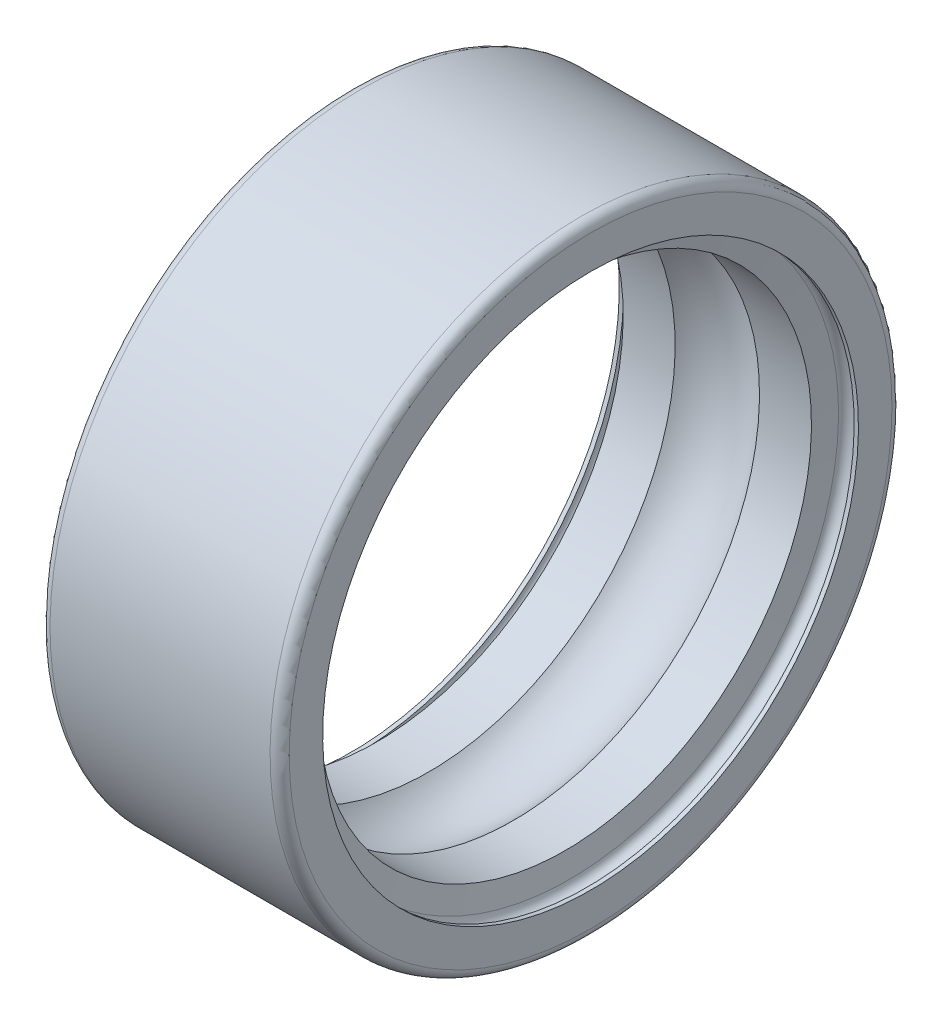
ISO-10303-21;
HEADER;
FILE_DESCRIPTION(('STEP AP214'),'2;1');
FILE_NAME('part.step','',(''),(''),'','','');
FILE_SCHEMA(('AUTOMOTIVE_DESIGN { 1 0 10303 214 1 1 1 1 }'));
ENDSEC;
DATA;
#1=APPLICATION_CONTEXT('core data for automotive mechanical design processes');
#2=APPLICATION_PROTOCOL_DEFINITION('international standard','automotive_design',2000,#1);
#3=PRODUCT_CONTEXT('',#1,'mechanical');
#4=PRODUCT('Part','Part','',(#3));
#5=PRODUCT_RELATED_PRODUCT_CATEGORY('part','',(#4));
#6=PRODUCT_DEFINITION_FORMATION('','',#4);
#7=PRODUCT_DEFINITION_CONTEXT('part definition',#1,'design');
#8=PRODUCT_DEFINITION('design','',#6,#7);
#9=PRODUCT_DEFINITION_SHAPE('','',#8);
#10=(LENGTH_UNIT() NAMED_UNIT(*) SI_UNIT(.MILLI.,.METRE.));
#11=(NAMED_UNIT(*) PLANE_ANGLE_UNIT() SI_UNIT($,.RADIAN.));
#12=(NAMED_UNIT(*) SI_UNIT($,.STERADIAN.) SOLID_ANGLE_UNIT());
#13=UNCERTAINTY_MEASURE_WITH_UNIT(LENGTH_MEASURE(1.E-05),#10,'distance_accuracy_value','');
#14=(GEOMETRIC_REPRESENTATION_CONTEXT(3) GLOBAL_UNCERTAINTY_ASSIGNED_CONTEXT((#13)) GLOBAL_UNIT_ASSIGNED_CONTEXT((#10,
#11,#12)) REPRESENTATION_CONTEXT('',''));
#15=CARTESIAN_POINT('',(0.,0.,0.));
#16=DIRECTION('',(0.,0.,1.));
#17=DIRECTION('',(1.,0.,0.));
#18=AXIS2_PLACEMENT_3D('',#15,#16,#17);
#19=CARTESIAN_POINT('',(4.73,0.,0.));
#20=DIRECTION('',(1.,0.,0.));
#21=DIRECTION('',(0.,0.,-1.));
#22=AXIS2_PLACEMENT_3D('',#19,#20,#21);
#23=TOROIDAL_SURFACE('',#22,5.6,0.18);
#24=CARTESIAN_POINT('',(4.91,0.,0.));
#25=DIRECTION('',(1.,0.,0.));
#26=DIRECTION('',(0.,1.,0.));
#27=AXIS2_PLACEMENT_3D('',#24,#25,#26);
#28=CIRCLE('',#27,5.6);
#29=CARTESIAN_POINT('',(4.91,5.6,0.));
#30=VERTEX_POINT('',#29);
#31=EDGE_CURVE('E10',#30,#30,#28,.T.);
#32=ORIENTED_EDGE('',*,*,#31,.T.);
#33=EDGE_LOOP('',(#32));
#34=FACE_BOUND('',#33,.T.);
#35=CARTESIAN_POINT('',(4.5527346044578,0.,0.));
#36=DIRECTION('',(1.,0.,0.));
#37=DIRECTION('',(0.,1.,0.));
#38=AXIS2_PLACEMENT_3D('',#35,#36,#37);
#39=CIRCLE('',#38,5.63125667198005);
#40=CARTESIAN_POINT('',(4.5527346044578,5.63125667198005,0.));
#41=VERTEX_POINT('',#40);
#42=EDGE_CURVE('E70',#41,#41,#39,.T.);
#43=ORIENTED_EDGE('',*,*,#42,.F.);
#44=EDGE_LOOP('',(#43));
#45=FACE_BOUND('',#44,.T.);
#46=ADVANCED_FACE('F15',(#34,#45),#23,.F.);
#47=CARTESIAN_POINT('',(4.955,0.,0.));
#48=DIRECTION('',(-1.,0.,0.));
#49=DIRECTION('',(0.,1.,0.));
#50=AXIS2_PLACEMENT_3D('',#47,#48,#49);
#51=CYLINDRICAL_SURFACE('',#50,5.6);
#52=CARTESIAN_POINT('',(5.,0.,0.));
#53=DIRECTION('',(1.,0.,0.));
#54=DIRECTION('',(0.,1.,0.));
#55=AXIS2_PLACEMENT_3D('',#52,#53,#54);
#56=CIRCLE('',#55,5.6);
#57=CARTESIAN_POINT('',(5.,5.6,0.));
#58=VERTEX_POINT('',#57);
#59=EDGE_CURVE('E25',#58,#58,#56,.T.);
#60=ORIENTED_EDGE('',*,*,#59,.T.);
#61=EDGE_LOOP('',(#60));
#62=FACE_BOUND('',#61,.T.);
#63=ORIENTED_EDGE('',*,*,#31,.F.);
#64=EDGE_LOOP('',(#63));
#65=FACE_BOUND('',#64,.T.);
#66=ADVANCED_FACE('F116',(#62,#65),#51,.F.);
#67=CARTESIAN_POINT('',(5.,5.95,0.));
#68=DIRECTION('',(1.,0.,0.));
#69=DIRECTION('',(0.,1.,0.));
#70=AXIS2_PLACEMENT_3D('',#67,#68,#69);
#71=PLANE('',#70);
#72=CARTESIAN_POINT('',(5.,0.,0.));
#73=DIRECTION('',(1.,0.,0.));
#74=DIRECTION('',(0.,1.,0.));
#75=AXIS2_PLACEMENT_3D('',#72,#73,#74);
#76=CIRCLE('',#75,6.3);
#77=CARTESIAN_POINT('',(5.,6.3,0.));
#78=VERTEX_POINT('',#77);
#79=EDGE_CURVE('E80',#78,#78,#76,.T.);
#80=ORIENTED_EDGE('',*,*,#79,.T.);
#81=EDGE_LOOP('',(#80));
#82=FACE_BOUND('',#81,.T.);
#83=ORIENTED_EDGE('',*,*,#59,.F.);
#84=EDGE_LOOP('',(#83));
#85=FACE_BOUND('',#84,.T.);
#86=ADVANCED_FACE('F121',(#82,#85),#71,.T.);
#87=CARTESIAN_POINT('',(4.8,0.,0.));
#88=DIRECTION('',(1.,0.,0.));
#89=DIRECTION('',(0.,0.,-1.));
#90=AXIS2_PLACEMENT_3D('',#87,#88,#89);
#91=TOROIDAL_SURFACE('',#90,6.3,0.2);
#92=CARTESIAN_POINT('',(4.8,0.,0.));
#93=DIRECTION('',(1.,0.,0.));
#94=DIRECTION('',(0.,1.,0.));
#95=AXIS2_PLACEMENT_3D('',#92,#93,#94);
#96=CIRCLE('',#95,6.5);
#97=CARTESIAN_POINT('',(4.8,6.5,0.));
#98=VERTEX_POINT('',#97);
#99=EDGE_CURVE('E84',#98,#98,#96,.T.);
#100=ORIENTED_EDGE('',*,*,#99,.T.);
#101=EDGE_LOOP('',(#100));
#102=FACE_BOUND('',#101,.T.);
#103=ORIENTED_EDGE('',*,*,#79,.F.);
#104=EDGE_LOOP('',(#103));
#105=FACE_BOUND('',#104,.T.);
#106=ADVANCED_FACE('F17',(#102,#105),#91,.T.);
#107=CARTESIAN_POINT('',(2.5,0.,0.));
#108=DIRECTION('',(-1.,0.,0.));
#109=DIRECTION('',(0.,1.,0.));
#110=AXIS2_PLACEMENT_3D('',#107,#108,#109);
#111=CYLINDRICAL_SURFACE('',#110,6.5);
#112=CARTESIAN_POINT('',(0.2,0.,0.));
#113=DIRECTION('',(1.,0.,0.));
#114=DIRECTION('',(0.,1.,0.));
#115=AXIS2_PLACEMENT_3D('',#112,#113,#114);
#116=CIRCLE('',#115,6.5);
#117=CARTESIAN_POINT('',(0.2,6.5,0.));
#118=VERTEX_POINT('',#117);
#119=EDGE_CURVE('E81',#118,#118,#116,.T.);
#120=ORIENTED_EDGE('',*,*,#119,.T.);
#121=EDGE_LOOP('',(#120));
#122=FACE_BOUND('',#121,.T.);
#123=ORIENTED_EDGE('',*,*,#99,.F.);
#124=EDGE_LOOP('',(#123));
#125=FACE_BOUND('',#124,.T.);
#126=ADVANCED_FACE('F127',(#122,#125),#111,.T.);
#127=CARTESIAN_POINT('',(0.2,0.,0.));
#128=DIRECTION('',(1.,0.,0.));
#129=DIRECTION('',(0.,0.,-1.));
#130=AXIS2_PLACEMENT_3D('',#127,#128,#129);
#131=TOROIDAL_SURFACE('',#130,6.3,0.2);
#132=CARTESIAN_POINT('',(0.,0.,0.));
#133=DIRECTION('',(1.,0.,0.));
#134=DIRECTION('',(0.,1.,0.));
#135=AXIS2_PLACEMENT_3D('',#132,#133,#134);
#136=CIRCLE('',#135,6.3);
#137=CARTESIAN_POINT('',(0.,6.3,0.));
#138=VERTEX_POINT('',#137);
#139=EDGE_CURVE('E85',#138,#138,#136,.T.);
#140=ORIENTED_EDGE('',*,*,#139,.T.);
#141=EDGE_LOOP('',(#140));
#142=FACE_BOUND('',#141,.T.);
#143=ORIENTED_EDGE('',*,*,#119,.F.);
#144=EDGE_LOOP('',(#143));
#145=FACE_BOUND('',#144,.T.);
#146=ADVANCED_FACE('F112',(#142,#145),#131,.T.);
#147=CARTESIAN_POINT('',(0.,5.95,0.));
#148=DIRECTION('',(-1.,0.,0.));
#149=DIRECTION('',(0.,-1.,0.));
#150=AXIS2_PLACEMENT_3D('',#147,#148,#149);
#151=PLANE('',#150);
#152=CARTESIAN_POINT('',(0.,0.,0.));
#153=DIRECTION('',(1.,0.,0.));
#154=DIRECTION('',(0.,1.,0.));
#155=AXIS2_PLACEMENT_3D('',#152,#153,#154);
#156=CIRCLE('',#155,5.6);
#157=CARTESIAN_POINT('',(0.,5.6,0.));
#158=VERTEX_POINT('',#157);
#159=EDGE_CURVE('E92',#158,#158,#156,.T.);
#160=ORIENTED_EDGE('',*,*,#159,.T.);
#161=EDGE_LOOP('',(#160));
#162=FACE_BOUND('',#161,.T.);
#163=ORIENTED_EDGE('',*,*,#139,.F.);
#164=EDGE_LOOP('',(#163));
#165=FACE_BOUND('',#164,.T.);
#166=ADVANCED_FACE('F96',(#162,#165),#151,.T.);
#167=CARTESIAN_POINT('',(0.045,0.,0.));
#168=DIRECTION('',(-1.,0.,0.));
#169=DIRECTION('',(0.,1.,0.));
#170=AXIS2_PLACEMENT_3D('',#167,#168,#169);
#171=CYLINDRICAL_SURFACE('',#170,5.6);
#172=CARTESIAN_POINT('',(0.09,0.,0.));
#173=DIRECTION('',(1.,0.,0.));
#174=DIRECTION('',(0.,1.,0.));
#175=AXIS2_PLACEMENT_3D('',#172,#173,#174);
#176=CIRCLE('',#175,5.6);
#177=CARTESIAN_POINT('',(0.09,5.6,0.));
#178=VERTEX_POINT('',#177);
#179=EDGE_CURVE('E88',#178,#178,#176,.T.);
#180=ORIENTED_EDGE('',*,*,#179,.T.);
#181=EDGE_LOOP('',(#180));
#182=FACE_BOUND('',#181,.T.);
#183=ORIENTED_EDGE('',*,*,#159,.F.);
#184=EDGE_LOOP('',(#183));
#185=FACE_BOUND('',#184,.T.);
#186=ADVANCED_FACE('F99',(#182,#185),#171,.F.);
#187=CARTESIAN_POINT('',(0.27,0.,0.));
#188=DIRECTION('',(1.,0.,0.));
#189=DIRECTION('',(0.,0.,-1.));
#190=AXIS2_PLACEMENT_3D('',#187,#188,#189);
#191=TOROIDAL_SURFACE('',#190,5.6,0.18);
#192=CARTESIAN_POINT('',(0.447265395542197,0.,0.));
#193=DIRECTION('',(1.,0.,0.));
#194=DIRECTION('',(0.,1.,0.));
#195=AXIS2_PLACEMENT_3D('',#192,#193,#194);
#196=CIRCLE('',#195,5.63125667198005);
#197=CARTESIAN_POINT('',(0.447265395542197,5.63125667198005,0.));
#198=VERTEX_POINT('',#197);
#199=EDGE_CURVE('E86',#198,#198,#196,.T.);
#200=ORIENTED_EDGE('',*,*,#199,.T.);
#201=EDGE_LOOP('',(#200));
#202=FACE_BOUND('',#201,.T.);
#203=ORIENTED_EDGE('',*,*,#179,.F.);
#204=EDGE_LOOP('',(#203));
#205=FACE_BOUND('',#204,.T.);
#206=ADVANCED_FACE('F101',(#202,#205),#191,.F.);
#207=CARTESIAN_POINT('',(0.48969466350022,0.,0.));
#208=DIRECTION('',(-1.,0.,0.));
#209=DIRECTION('',(0.,1.,0.));
#210=AXIS2_PLACEMENT_3D('',#207,#208,#209);
#211=CONICAL_SURFACE('',#210,5.39062833599002,1.39626340159546);
#212=CARTESIAN_POINT('',(0.532123931458243,0.,0.));
#213=DIRECTION('',(1.,0.,0.));
#214=DIRECTION('',(0.,1.,0.));
#215=AXIS2_PLACEMENT_3D('',#212,#213,#214);
#216=CIRCLE('',#215,5.15);
#217=CARTESIAN_POINT('',(0.532123931458243,5.15,0.));
#218=VERTEX_POINT('',#217);
#219=EDGE_CURVE('E89',#218,#218,#216,.T.);
#220=ORIENTED_EDGE('',*,*,#219,.T.);
#221=EDGE_LOOP('',(#220));
#222=FACE_BOUND('',#221,.T.);
#223=ORIENTED_EDGE('',*,*,#199,.F.);
#224=EDGE_LOOP('',(#223));
#225=FACE_BOUND('',#224,.T.);
#226=ADVANCED_FACE('F109',(#222,#225),#211,.F.);
#227=CARTESIAN_POINT('',(1.07524163668338,0.,0.));
#228=DIRECTION('',(-1.,0.,0.));
#229=DIRECTION('',(0.,1.,0.));
#230=AXIS2_PLACEMENT_3D('',#227,#228,#229);
#231=CYLINDRICAL_SURFACE('',#230,5.15);
#232=CARTESIAN_POINT('',(1.61835934190851,0.,0.));
#233=DIRECTION('',(1.,0.,0.));
#234=DIRECTION('',(0.,1.,0.));
#235=AXIS2_PLACEMENT_3D('',#232,#233,#234);
#236=CIRCLE('',#235,5.15);
#237=CARTESIAN_POINT('',(1.61835934190851,5.15,0.));
#238=VERTEX_POINT('',#237);
#239=EDGE_CURVE('E75',#238,#238,#236,.T.);
#240=ORIENTED_EDGE('',*,*,#239,.T.);
#241=EDGE_LOOP('',(#240));
#242=FACE_BOUND('',#241,.T.);
#243=ORIENTED_EDGE('',*,*,#219,.F.);
#244=EDGE_LOOP('',(#243));
#245=FACE_BOUND('',#244,.T.);
#246=ADVANCED_FACE('F145',(#242,#245),#231,.F.);
#247=CARTESIAN_POINT('',(2.5,0.,0.));
#248=DIRECTION('',(1.,0.,0.));
#249=DIRECTION('',(0.,0.,-1.));
#250=AXIS2_PLACEMENT_3D('',#247,#248,#249);
#251=TOROIDAL_SURFACE('',#250,4.35,1.1905);
#252=CARTESIAN_POINT('',(3.38164065809149,0.,0.));
#253=DIRECTION('',(1.,0.,0.));
#254=DIRECTION('',(0.,1.,0.));
#255=AXIS2_PLACEMENT_3D('',#252,#253,#254);
#256=CIRCLE('',#255,5.15);
#257=CARTESIAN_POINT('',(3.38164065809149,5.15,0.));
#258=VERTEX_POINT('',#257);
#259=EDGE_CURVE('E71',#258,#258,#256,.T.);
#260=ORIENTED_EDGE('',*,*,#259,.T.);
#261=EDGE_LOOP('',(#260));
#262=FACE_BOUND('',#261,.T.);
#263=ORIENTED_EDGE('',*,*,#239,.F.);
#264=EDGE_LOOP('',(#263));
#265=FACE_BOUND('',#264,.T.);
#266=ADVANCED_FACE('F147',(#262,#265),#251,.F.);
#267=CARTESIAN_POINT('',(3.92475836331662,0.,0.));
#268=DIRECTION('',(-1.,0.,0.));
#269=DIRECTION('',(0.,1.,0.));
#270=AXIS2_PLACEMENT_3D('',#267,#268,#269);
#271=CYLINDRICAL_SURFACE('',#270,5.15);
#272=CARTESIAN_POINT('',(4.46787606854175,0.,0.));
#273=DIRECTION('',(1.,0.,0.));
#274=DIRECTION('',(0.,1.,0.));
#275=AXIS2_PLACEMENT_3D('',#272,#273,#274);
#276=CIRCLE('',#275,5.15);
#277=CARTESIAN_POINT('',(4.46787606854175,5.15,0.));
#278=VERTEX_POINT('',#277);
#279=EDGE_CURVE('E19',#278,#278,#276,.T.);
#280=ORIENTED_EDGE('',*,*,#279,.T.);
#281=EDGE_LOOP('',(#280));
#282=FACE_BOUND('',#281,.T.);
#283=ORIENTED_EDGE('',*,*,#259,.F.);
#284=EDGE_LOOP('',(#283));
#285=FACE_BOUND('',#284,.T.);
#286=ADVANCED_FACE('F67',(#282,#285),#271,.F.);
#287=CARTESIAN_POINT('',(4.51030533649978,0.,0.));
#288=DIRECTION('',(1.,0.,0.));
#289=DIRECTION('',(0.,1.,0.));
#290=AXIS2_PLACEMENT_3D('',#287,#288,#289);
#291=CONICAL_SURFACE('',#290,5.39062833599002,1.39626340159546);
#292=ORIENTED_EDGE('',*,*,#42,.T.);
#293=EDGE_LOOP('',(#292));
#294=FACE_BOUND('',#293,.T.);
#295=ORIENTED_EDGE('',*,*,#279,.F.);
#296=EDGE_LOOP('',(#295));
#297=FACE_BOUND('',#296,.T.);
#298=ADVANCED_FACE('F159',(#294,#297),#291,.F.);
#299=CLOSED_SHELL('',(#46,#66,#86,#106,#126,#146,#166,#186,#206,#226,#246,#266,#286,#298));
#300=MANIFOLD_SOLID_BREP('B1',#299);
#301=ADVANCED_BREP_SHAPE_REPRESENTATION('',(#18,#300),#14);
#302=SHAPE_DEFINITION_REPRESENTATION(#9,#301);
ENDSEC;
END-ISO-10303-21;
